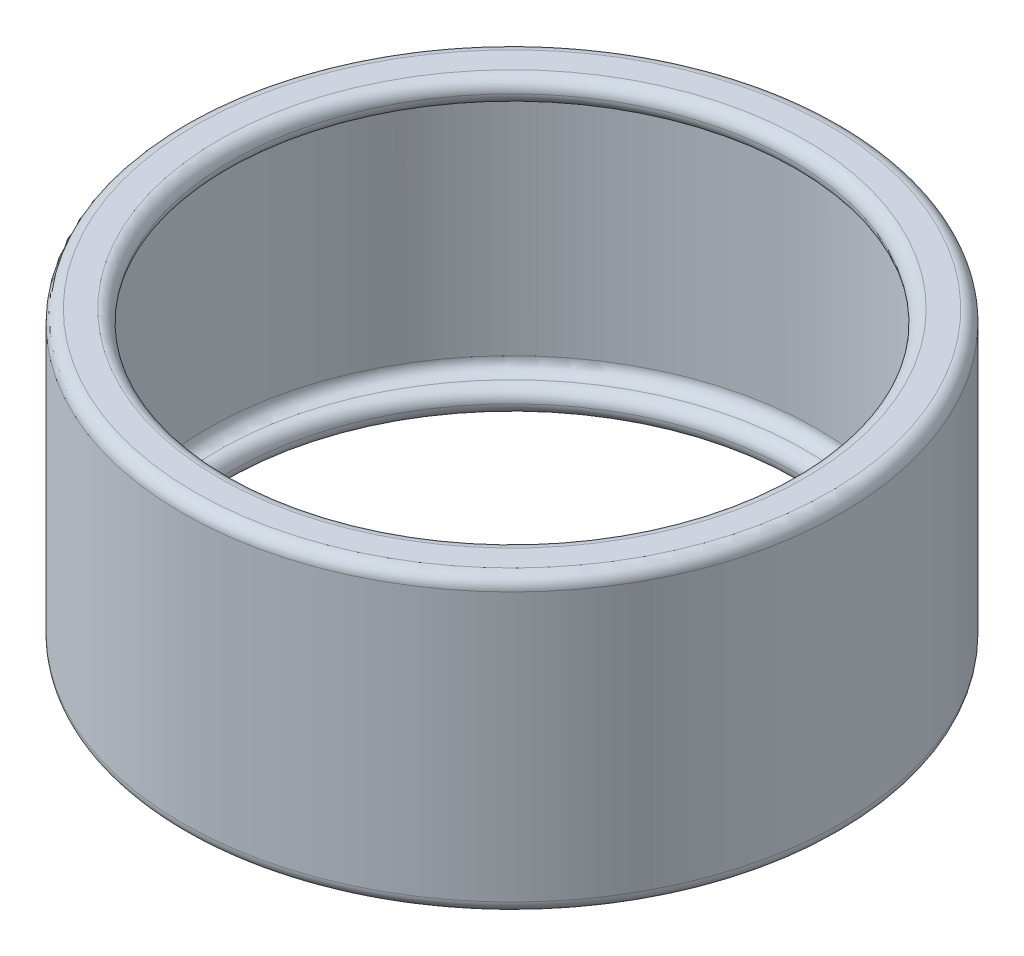
ISO-10303-21;
HEADER;
FILE_DESCRIPTION(('STEP AP214'),'2;1');
FILE_NAME('part.step','',(''),(''),'','','');
FILE_SCHEMA(('AUTOMOTIVE_DESIGN { 1 0 10303 214 1 1 1 1 }'));
ENDSEC;
DATA;
#1=APPLICATION_CONTEXT('core data for automotive mechanical design processes');
#2=APPLICATION_PROTOCOL_DEFINITION('international standard','automotive_design',2000,#1);
#3=PRODUCT_CONTEXT('',#1,'mechanical');
#4=PRODUCT('Part','Part','',(#3));
#5=PRODUCT_RELATED_PRODUCT_CATEGORY('part','',(#4));
#6=PRODUCT_DEFINITION_FORMATION('','',#4);
#7=PRODUCT_DEFINITION_CONTEXT('part definition',#1,'design');
#8=PRODUCT_DEFINITION('design','',#6,#7);
#9=PRODUCT_DEFINITION_SHAPE('','',#8);
#10=(LENGTH_UNIT() NAMED_UNIT(*) SI_UNIT(.MILLI.,.METRE.));
#11=(NAMED_UNIT(*) PLANE_ANGLE_UNIT() SI_UNIT($,.RADIAN.));
#12=(NAMED_UNIT(*) SI_UNIT($,.STERADIAN.) SOLID_ANGLE_UNIT());
#13=UNCERTAINTY_MEASURE_WITH_UNIT(LENGTH_MEASURE(1.E-05),#10,'distance_accuracy_value','');
#14=(GEOMETRIC_REPRESENTATION_CONTEXT(3) GLOBAL_UNCERTAINTY_ASSIGNED_CONTEXT((#13)) GLOBAL_UNIT_ASSIGNED_CONTEXT((#10,
#11,#12)) REPRESENTATION_CONTEXT('',''));
#15=CARTESIAN_POINT('',(0.,0.,0.));
#16=DIRECTION('',(0.,0.,1.));
#17=DIRECTION('',(1.,0.,0.));
#18=AXIS2_PLACEMENT_3D('',#15,#16,#17);
#19=CARTESIAN_POINT('',(27.,12.,0.));
#20=DIRECTION('',(0.,1.,0.));
#21=DIRECTION('',(0.,0.,1.));
#22=AXIS2_PLACEMENT_3D('',#19,#20,#21);
#23=PLANE('',#22);
#24=CARTESIAN_POINT('',(0.,12.,0.));
#25=DIRECTION('',(0.,1.,0.));
#26=DIRECTION('',(0.,0.,1.));
#27=AXIS2_PLACEMENT_3D('',#24,#25,#26);
#28=CIRCLE('',#27,24.);
#29=CARTESIAN_POINT('',(0.,12.,24.));
#30=VERTEX_POINT('',#29);
#31=EDGE_CURVE('E10',#30,#30,#28,.F.);
#32=ORIENTED_EDGE('',*,*,#31,.T.);
#33=EDGE_LOOP('',(#32));
#34=FACE_BOUND('',#33,.T.);
#35=CARTESIAN_POINT('',(0.,12.,0.));
#36=DIRECTION('',(0.,1.,0.));
#37=DIRECTION('',(0.,0.,1.));
#38=AXIS2_PLACEMENT_3D('',#35,#36,#37);
#39=CIRCLE('',#38,26.);
#40=CARTESIAN_POINT('',(0.,12.,26.));
#41=VERTEX_POINT('',#40);
#42=EDGE_CURVE('E44',#41,#41,#39,.T.);
#43=ORIENTED_EDGE('',*,*,#42,.T.);
#44=EDGE_LOOP('',(#43));
#45=FACE_BOUND('',#44,.T.);
#46=ADVANCED_FACE('F36',(#34,#45),#23,.T.);
#47=CARTESIAN_POINT('',(23.,10.,0.));
#48=DIRECTION('',(0.,-1.,0.));
#49=DIRECTION('',(0.,0.,-1.));
#50=AXIS2_PLACEMENT_3D('',#47,#48,#49);
#51=PLANE('',#50);
#52=CARTESIAN_POINT('',(0.,10.,0.));
#53=DIRECTION('',(0.,-1.,0.));
#54=DIRECTION('',(0.,0.,-1.));
#55=AXIS2_PLACEMENT_3D('',#52,#53,#54);
#56=CIRCLE('',#55,24.);
#57=CARTESIAN_POINT('',(0.,10.,-24.));
#58=VERTEX_POINT('',#57);
#59=EDGE_CURVE('E115',#58,#58,#56,.F.);
#60=ORIENTED_EDGE('',*,*,#59,.T.);
#61=EDGE_LOOP('',(#60));
#62=FACE_BOUND('',#61,.T.);
#63=CARTESIAN_POINT('',(0.,10.,0.));
#64=DIRECTION('',(0.,-1.,0.));
#65=DIRECTION('',(0.,0.,-1.));
#66=AXIS2_PLACEMENT_3D('',#63,#64,#65);
#67=CIRCLE('',#66,25.);
#68=CARTESIAN_POINT('',(0.,10.,-25.));
#69=VERTEX_POINT('',#68);
#70=EDGE_CURVE('E55',#69,#69,#67,.T.);
#71=ORIENTED_EDGE('',*,*,#70,.T.);
#72=EDGE_LOOP('',(#71));
#73=FACE_BOUND('',#72,.T.);
#74=ADVANCED_FACE('F82',(#62,#73),#51,.T.);
#75=CARTESIAN_POINT('',(0.,0.,0.));
#76=DIRECTION('',(0.,-1.,0.));
#77=DIRECTION('',(0.,0.,-1.));
#78=AXIS2_PLACEMENT_3D('',#75,#76,#77);
#79=CYLINDRICAL_SURFACE('',#78,25.);
#80=CARTESIAN_POINT('',(0.,-9.,0.));
#81=DIRECTION('',(0.,1.,0.));
#82=DIRECTION('',(0.,0.,1.));
#83=AXIS2_PLACEMENT_3D('',#80,#81,#82);
#84=CIRCLE('',#83,25.);
#85=CARTESIAN_POINT('',(0.,-9.,25.));
#86=VERTEX_POINT('',#85);
#87=EDGE_CURVE('E49',#86,#86,#84,.F.);
#88=ORIENTED_EDGE('',*,*,#87,.T.);
#89=EDGE_LOOP('',(#88));
#90=FACE_BOUND('',#89,.T.);
#91=ORIENTED_EDGE('',*,*,#70,.F.);
#92=EDGE_LOOP('',(#91));
#93=FACE_BOUND('',#92,.T.);
#94=ADVANCED_FACE('F87',(#90,#93),#79,.F.);
#95=CARTESIAN_POINT('',(27.,-12.,0.));
#96=DIRECTION('',(0.,-1.,0.));
#97=DIRECTION('',(0.,0.,-1.));
#98=AXIS2_PLACEMENT_3D('',#95,#96,#97);
#99=PLANE('',#98);
#100=CARTESIAN_POINT('',(0.,-12.,0.));
#101=DIRECTION('',(0.,-1.,0.));
#102=DIRECTION('',(0.,0.,-1.));
#103=AXIS2_PLACEMENT_3D('',#100,#101,#102);
#104=CIRCLE('',#103,24.);
#105=CARTESIAN_POINT('',(0.,-12.,-24.));
#106=VERTEX_POINT('',#105);
#107=EDGE_CURVE('E106',#106,#106,#104,.F.);
#108=ORIENTED_EDGE('',*,*,#107,.T.);
#109=EDGE_LOOP('',(#108));
#110=FACE_BOUND('',#109,.T.);
#111=CARTESIAN_POINT('',(0.,-12.,0.));
#112=DIRECTION('',(0.,-1.,0.));
#113=DIRECTION('',(0.,0.,-1.));
#114=AXIS2_PLACEMENT_3D('',#111,#112,#113);
#115=CIRCLE('',#114,26.);
#116=CARTESIAN_POINT('',(0.,-12.,-26.));
#117=VERTEX_POINT('',#116);
#118=EDGE_CURVE('E109',#117,#117,#115,.T.);
#119=ORIENTED_EDGE('',*,*,#118,.T.);
#120=EDGE_LOOP('',(#119));
#121=FACE_BOUND('',#120,.T.);
#122=ADVANCED_FACE('F124',(#110,#121),#99,.T.);
#123=CARTESIAN_POINT('',(0.,0.,0.));
#124=DIRECTION('',(0.,-1.,0.));
#125=DIRECTION('',(0.,0.,-1.));
#126=AXIS2_PLACEMENT_3D('',#123,#124,#125);
#127=CYLINDRICAL_SURFACE('',#126,27.);
#128=CARTESIAN_POINT('',(0.,-11.,0.));
#129=DIRECTION('',(0.,-1.,0.));
#130=DIRECTION('',(0.,0.,-1.));
#131=AXIS2_PLACEMENT_3D('',#128,#129,#130);
#132=CIRCLE('',#131,27.);
#133=CARTESIAN_POINT('',(0.,-11.,-27.));
#134=VERTEX_POINT('',#133);
#135=EDGE_CURVE('E112',#134,#134,#132,.F.);
#136=ORIENTED_EDGE('',*,*,#135,.T.);
#137=EDGE_LOOP('',(#136));
#138=FACE_BOUND('',#137,.T.);
#139=CARTESIAN_POINT('',(0.,11.,0.));
#140=DIRECTION('',(0.,1.,0.));
#141=DIRECTION('',(0.,0.,1.));
#142=AXIS2_PLACEMENT_3D('',#139,#140,#141);
#143=CIRCLE('',#142,27.);
#144=CARTESIAN_POINT('',(0.,11.,27.));
#145=VERTEX_POINT('',#144);
#146=EDGE_CURVE('E108',#145,#145,#143,.F.);
#147=ORIENTED_EDGE('',*,*,#146,.T.);
#148=EDGE_LOOP('',(#147));
#149=FACE_BOUND('',#148,.T.);
#150=ADVANCED_FACE('F95',(#138,#149),#127,.T.);
#151=CARTESIAN_POINT('',(0.,11.,0.));
#152=DIRECTION('',(0.,1.,0.));
#153=DIRECTION('',(0.,0.,1.));
#154=AXIS2_PLACEMENT_3D('',#151,#152,#153);
#155=TOROIDAL_SURFACE('',#154,24.,1.);
#156=ORIENTED_EDGE('',*,*,#31,.F.);
#157=EDGE_LOOP('',(#156));
#158=FACE_BOUND('',#157,.T.);
#159=CARTESIAN_POINT('',(0.,11.,0.));
#160=DIRECTION('',(0.,1.,0.));
#161=DIRECTION('',(0.,0.,1.));
#162=AXIS2_PLACEMENT_3D('',#159,#160,#161);
#163=CIRCLE('',#162,23.);
#164=CARTESIAN_POINT('',(0.,11.,23.));
#165=VERTEX_POINT('',#164);
#166=EDGE_CURVE('E53',#165,#165,#163,.T.);
#167=ORIENTED_EDGE('',*,*,#166,.F.);
#168=EDGE_LOOP('',(#167));
#169=FACE_BOUND('',#168,.T.);
#170=ADVANCED_FACE('F77',(#158,#169),#155,.T.);
#171=CARTESIAN_POINT('',(0.,11.,0.));
#172=DIRECTION('',(0.,-1.,0.));
#173=DIRECTION('',(0.,0.,-1.));
#174=AXIS2_PLACEMENT_3D('',#171,#172,#173);
#175=TOROIDAL_SURFACE('',#174,24.,1.);
#176=ORIENTED_EDGE('',*,*,#59,.F.);
#177=EDGE_LOOP('',(#176));
#178=FACE_BOUND('',#177,.T.);
#179=ORIENTED_EDGE('',*,*,#166,.T.);
#180=EDGE_LOOP('',(#179));
#181=FACE_BOUND('',#180,.T.);
#182=ADVANCED_FACE('F68',(#178,#181),#175,.T.);
#183=CARTESIAN_POINT('',(0.,-9.,0.));
#184=DIRECTION('',(0.,1.,0.));
#185=DIRECTION('',(0.,0.,1.));
#186=AXIS2_PLACEMENT_3D('',#183,#184,#185);
#187=TOROIDAL_SURFACE('',#186,24.,1.);
#188=ORIENTED_EDGE('',*,*,#87,.F.);
#189=EDGE_LOOP('',(#188));
#190=FACE_BOUND('',#189,.T.);
#191=CARTESIAN_POINT('',(0.,-10.,0.));
#192=DIRECTION('',(0.,1.,0.));
#193=DIRECTION('',(0.,0.,1.));
#194=AXIS2_PLACEMENT_3D('',#191,#192,#193);
#195=CIRCLE('',#194,24.);
#196=CARTESIAN_POINT('',(0.,-10.,24.));
#197=VERTEX_POINT('',#196);
#198=EDGE_CURVE('E40',#197,#197,#195,.T.);
#199=ORIENTED_EDGE('',*,*,#198,.F.);
#200=EDGE_LOOP('',(#199));
#201=FACE_BOUND('',#200,.T.);
#202=ADVANCED_FACE('F66',(#190,#201),#187,.F.);
#203=CARTESIAN_POINT('',(0.,-11.,0.));
#204=DIRECTION('',(0.,1.,0.));
#205=DIRECTION('',(0.,0.,1.));
#206=AXIS2_PLACEMENT_3D('',#203,#204,#205);
#207=TOROIDAL_SURFACE('',#206,24.,1.);
#208=ORIENTED_EDGE('',*,*,#198,.T.);
#209=EDGE_LOOP('',(#208));
#210=FACE_BOUND('',#209,.T.);
#211=CARTESIAN_POINT('',(0.,-11.,0.));
#212=DIRECTION('',(0.,1.,0.));
#213=DIRECTION('',(0.,0.,1.));
#214=AXIS2_PLACEMENT_3D('',#211,#212,#213);
#215=CIRCLE('',#214,23.);
#216=CARTESIAN_POINT('',(0.,-11.,23.));
#217=VERTEX_POINT('',#216);
#218=EDGE_CURVE('E56',#217,#217,#215,.T.);
#219=ORIENTED_EDGE('',*,*,#218,.F.);
#220=EDGE_LOOP('',(#219));
#221=FACE_BOUND('',#220,.T.);
#222=ADVANCED_FACE('F63',(#210,#221),#207,.T.);
#223=CARTESIAN_POINT('',(0.,-11.,0.));
#224=DIRECTION('',(0.,-1.,0.));
#225=DIRECTION('',(0.,0.,-1.));
#226=AXIS2_PLACEMENT_3D('',#223,#224,#225);
#227=TOROIDAL_SURFACE('',#226,24.,1.);
#228=ORIENTED_EDGE('',*,*,#107,.F.);
#229=EDGE_LOOP('',(#228));
#230=FACE_BOUND('',#229,.T.);
#231=ORIENTED_EDGE('',*,*,#218,.T.);
#232=EDGE_LOOP('',(#231));
#233=FACE_BOUND('',#232,.T.);
#234=ADVANCED_FACE('F75',(#230,#233),#227,.T.);
#235=CARTESIAN_POINT('',(0.,-11.,0.));
#236=DIRECTION('',(0.,-1.,0.));
#237=DIRECTION('',(0.,0.,-1.));
#238=AXIS2_PLACEMENT_3D('',#235,#236,#237);
#239=TOROIDAL_SURFACE('',#238,26.,1.);
#240=ORIENTED_EDGE('',*,*,#135,.F.);
#241=EDGE_LOOP('',(#240));
#242=FACE_BOUND('',#241,.T.);
#243=ORIENTED_EDGE('',*,*,#118,.F.);
#244=EDGE_LOOP('',(#243));
#245=FACE_BOUND('',#244,.T.);
#246=ADVANCED_FACE('F98',(#242,#245),#239,.T.);
#247=CARTESIAN_POINT('',(0.,11.,0.));
#248=DIRECTION('',(0.,1.,0.));
#249=DIRECTION('',(0.,0.,1.));
#250=AXIS2_PLACEMENT_3D('',#247,#248,#249);
#251=TOROIDAL_SURFACE('',#250,26.,1.);
#252=ORIENTED_EDGE('',*,*,#42,.F.);
#253=EDGE_LOOP('',(#252));
#254=FACE_BOUND('',#253,.T.);
#255=ORIENTED_EDGE('',*,*,#146,.F.);
#256=EDGE_LOOP('',(#255));
#257=FACE_BOUND('',#256,.T.);
#258=ADVANCED_FACE('F38',(#254,#257),#251,.T.);
#259=CLOSED_SHELL('',(#46,#74,#94,#122,#150,#170,#182,#202,#222,#234,#246,#258));
#260=MANIFOLD_SOLID_BREP('B2',#259);
#261=ADVANCED_BREP_SHAPE_REPRESENTATION('',(#18,#260),#14);
#262=SHAPE_DEFINITION_REPRESENTATION(#9,#261);
ENDSEC;
END-ISO-10303-21;
